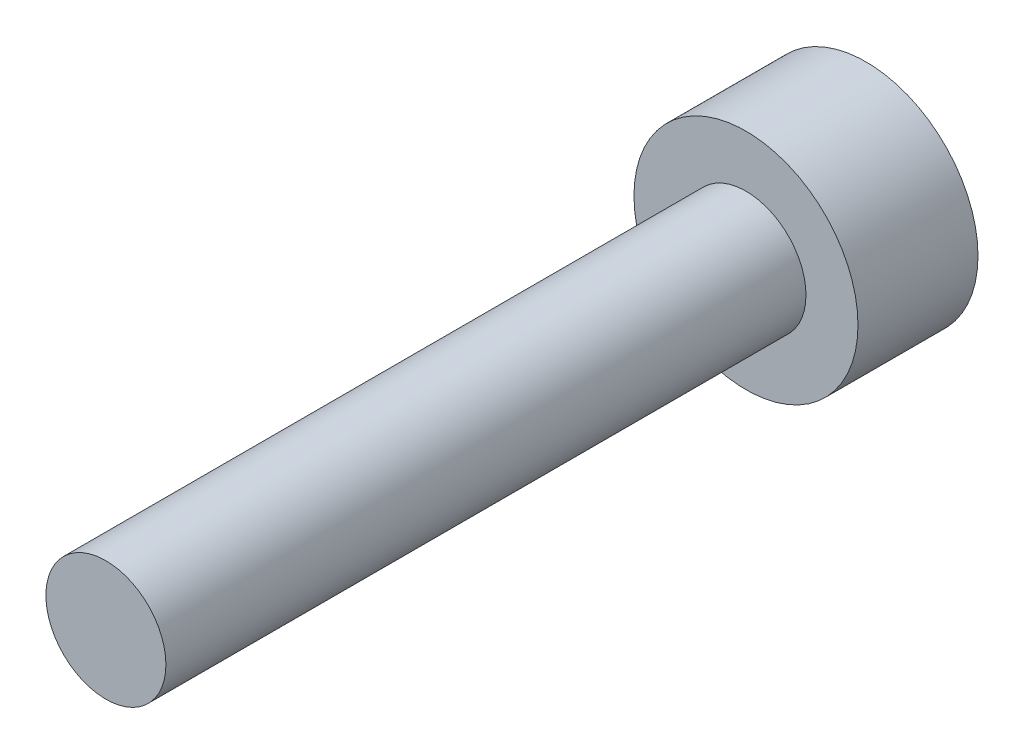
ISO-10303-21;
HEADER;
FILE_DESCRIPTION(('STEP AP214'),'2;1');
FILE_NAME('part.step','',(''),(''),'','','');
FILE_SCHEMA(('AUTOMOTIVE_DESIGN { 1 0 10303 214 1 1 1 1 }'));
ENDSEC;
DATA;
#1=APPLICATION_CONTEXT('core data for automotive mechanical design processes');
#2=APPLICATION_PROTOCOL_DEFINITION('international standard','automotive_design',2000,#1);
#3=PRODUCT_CONTEXT('',#1,'mechanical');
#4=PRODUCT('Part','Part','',(#3));
#5=PRODUCT_RELATED_PRODUCT_CATEGORY('part','',(#4));
#6=PRODUCT_DEFINITION_FORMATION('','',#4);
#7=PRODUCT_DEFINITION_CONTEXT('part definition',#1,'design');
#8=PRODUCT_DEFINITION('design','',#6,#7);
#9=PRODUCT_DEFINITION_SHAPE('','',#8);
#10=(LENGTH_UNIT() NAMED_UNIT(*) SI_UNIT(.MILLI.,.METRE.));
#11=(NAMED_UNIT(*) PLANE_ANGLE_UNIT() SI_UNIT($,.RADIAN.));
#12=(NAMED_UNIT(*) SI_UNIT($,.STERADIAN.) SOLID_ANGLE_UNIT());
#13=UNCERTAINTY_MEASURE_WITH_UNIT(LENGTH_MEASURE(1.E-05),#10,'distance_accuracy_value','');
#14=(GEOMETRIC_REPRESENTATION_CONTEXT(3) GLOBAL_UNCERTAINTY_ASSIGNED_CONTEXT((#13)) GLOBAL_UNIT_ASSIGNED_CONTEXT((#10,
#11,#12)) REPRESENTATION_CONTEXT('',''));
#15=CARTESIAN_POINT('',(0.,0.,0.));
#16=DIRECTION('',(0.,0.,1.));
#17=DIRECTION('',(1.,0.,0.));
#18=AXIS2_PLACEMENT_3D('',#15,#16,#17);
#19=CARTESIAN_POINT('',(0.,0.,-3.));
#20=DIRECTION('',(0.,0.,1.));
#21=DIRECTION('',(1.,0.,0.));
#22=AXIS2_PLACEMENT_3D('',#19,#20,#21);
#23=PLANE('',#22);
#24=CARTESIAN_POINT('',(0.,0.,-3.));
#25=DIRECTION('',(0.,0.,1.));
#26=DIRECTION('',(1.,0.,0.));
#27=AXIS2_PLACEMENT_3D('',#24,#25,#26);
#28=CIRCLE('',#27,2.8);
#29=CARTESIAN_POINT('',(2.8,0.,-3.));
#30=VERTEX_POINT('',#29);
#31=EDGE_CURVE('E112',#30,#30,#28,.T.);
#32=ORIENTED_EDGE('',*,*,#31,.F.);
#33=EDGE_LOOP('',(#32));
#34=FACE_BOUND('',#33,.T.);
#35=DIRECTION('',(0.,-1.,0.));
#36=VECTOR('',#35,1.);
#37=CARTESIAN_POINT('',(1.25,0.,-3.));
#38=LINE('',#37,#36);
#39=CARTESIAN_POINT('',(1.25,0.721687836487032,-3.));
#40=VERTEX_POINT('',#39);
#41=CARTESIAN_POINT('',(1.25,-0.721687836487033,-3.));
#42=VERTEX_POINT('',#41);
#43=EDGE_CURVE('E11',#40,#42,#38,.T.);
#44=ORIENTED_EDGE('',*,*,#43,.F.);
#45=DIRECTION('',(0.866025403784439,-0.5,0.));
#46=VECTOR('',#45,1.);
#47=CARTESIAN_POINT('',(0.625,1.08253175473055,-3.));
#48=LINE('',#47,#46);
#49=CARTESIAN_POINT('',(0.,1.44337567297406,-3.));
#50=VERTEX_POINT('',#49);
#51=EDGE_CURVE('E50',#50,#40,#48,.T.);
#52=ORIENTED_EDGE('',*,*,#51,.F.);
#53=DIRECTION('',(0.866025403784439,0.5,0.));
#54=VECTOR('',#53,1.);
#55=CARTESIAN_POINT('',(-0.625,1.08253175473055,-3.));
#56=LINE('',#55,#54);
#57=CARTESIAN_POINT('',(-1.25,0.721687836487032,-3.));
#58=VERTEX_POINT('',#57);
#59=EDGE_CURVE('E132',#58,#50,#56,.T.);
#60=ORIENTED_EDGE('',*,*,#59,.F.);
#61=DIRECTION('',(0.,1.,0.));
#62=VECTOR('',#61,1.);
#63=CARTESIAN_POINT('',(-1.25,0.,-3.));
#64=LINE('',#63,#62);
#65=CARTESIAN_POINT('',(-1.25,-0.721687836487032,-3.));
#66=VERTEX_POINT('',#65);
#67=EDGE_CURVE('E129',#66,#58,#64,.T.);
#68=ORIENTED_EDGE('',*,*,#67,.F.);
#69=DIRECTION('',(-0.866025403784439,0.5,0.));
#70=VECTOR('',#69,1.);
#71=CARTESIAN_POINT('',(-0.625,-1.08253175473055,-3.));
#72=LINE('',#71,#70);
#73=CARTESIAN_POINT('',(0.,-1.44337567297406,-3.));
#74=VERTEX_POINT('',#73);
#75=EDGE_CURVE('E130',#74,#66,#72,.T.);
#76=ORIENTED_EDGE('',*,*,#75,.F.);
#77=DIRECTION('',(-0.866025403784439,-0.5,0.));
#78=VECTOR('',#77,1.);
#79=CARTESIAN_POINT('',(0.624999999999999,-1.08253175473055,-3.));
#80=LINE('',#79,#78);
#81=EDGE_CURVE('E118',#42,#74,#80,.T.);
#82=ORIENTED_EDGE('',*,*,#81,.F.);
#83=EDGE_LOOP('',(#44,#52,#60,#68,#76,#82));
#84=FACE_BOUND('',#83,.T.);
#85=ADVANCED_FACE('F39',(#34,#84),#23,.F.);
#86=CARTESIAN_POINT('',(0.,0.,0.));
#87=DIRECTION('',(0.,0.,-1.));
#88=DIRECTION('',(-1.,0.,0.));
#89=AXIS2_PLACEMENT_3D('',#86,#87,#88);
#90=CYLINDRICAL_SURFACE('',#89,2.8);
#91=CARTESIAN_POINT('',(0.,0.,0.));
#92=DIRECTION('',(0.,0.,1.));
#93=DIRECTION('',(1.,0.,0.));
#94=AXIS2_PLACEMENT_3D('',#91,#92,#93);
#95=CIRCLE('',#94,2.8);
#96=CARTESIAN_POINT('',(2.8,0.,0.));
#97=VERTEX_POINT('',#96);
#98=EDGE_CURVE('E122',#97,#97,#95,.T.);
#99=ORIENTED_EDGE('',*,*,#98,.F.);
#100=EDGE_LOOP('',(#99));
#101=FACE_BOUND('',#100,.T.);
#102=ORIENTED_EDGE('',*,*,#31,.T.);
#103=EDGE_LOOP('',(#102));
#104=FACE_BOUND('',#103,.T.);
#105=ADVANCED_FACE('F41',(#101,#104),#90,.T.);
#106=CARTESIAN_POINT('',(0.,0.,0.));
#107=DIRECTION('',(0.,0.,1.));
#108=DIRECTION('',(1.,0.,0.));
#109=AXIS2_PLACEMENT_3D('',#106,#107,#108);
#110=PLANE('',#109);
#111=CARTESIAN_POINT('',(0.,0.,0.));
#112=DIRECTION('',(0.,0.,1.));
#113=DIRECTION('',(1.,0.,0.));
#114=AXIS2_PLACEMENT_3D('',#111,#112,#113);
#115=CIRCLE('',#114,1.5);
#116=CARTESIAN_POINT('',(1.5,0.,0.));
#117=VERTEX_POINT('',#116);
#118=EDGE_CURVE('E120',#117,#117,#115,.T.);
#119=ORIENTED_EDGE('',*,*,#118,.F.);
#120=EDGE_LOOP('',(#119));
#121=FACE_BOUND('',#120,.T.);
#122=ORIENTED_EDGE('',*,*,#98,.T.);
#123=EDGE_LOOP('',(#122));
#124=FACE_BOUND('',#123,.T.);
#125=ADVANCED_FACE('F179',(#121,#124),#110,.T.);
#126=CARTESIAN_POINT('',(0.,0.,16.));
#127=DIRECTION('',(0.,0.,-1.));
#128=DIRECTION('',(-1.,0.,0.));
#129=AXIS2_PLACEMENT_3D('',#126,#127,#128);
#130=CYLINDRICAL_SURFACE('',#129,1.5);
#131=CARTESIAN_POINT('',(0.,0.,16.));
#132=DIRECTION('',(0.,0.,1.));
#133=DIRECTION('',(1.,0.,0.));
#134=AXIS2_PLACEMENT_3D('',#131,#132,#133);
#135=CIRCLE('',#134,1.5);
#136=CARTESIAN_POINT('',(1.5,0.,16.));
#137=VERTEX_POINT('',#136);
#138=EDGE_CURVE('E110',#137,#137,#135,.T.);
#139=ORIENTED_EDGE('',*,*,#138,.F.);
#140=EDGE_LOOP('',(#139));
#141=FACE_BOUND('',#140,.T.);
#142=ORIENTED_EDGE('',*,*,#118,.T.);
#143=EDGE_LOOP('',(#142));
#144=FACE_BOUND('',#143,.T.);
#145=ADVANCED_FACE('F184',(#141,#144),#130,.T.);
#146=CARTESIAN_POINT('',(0.,0.,16.));
#147=DIRECTION('',(0.,0.,1.));
#148=DIRECTION('',(1.,0.,0.));
#149=AXIS2_PLACEMENT_3D('',#146,#147,#148);
#150=PLANE('',#149);
#151=ORIENTED_EDGE('',*,*,#138,.T.);
#152=EDGE_LOOP('',(#151));
#153=FACE_BOUND('',#152,.T.);
#154=ADVANCED_FACE('F189',(#153),#150,.T.);
#155=CARTESIAN_POINT('',(1.25,-0.721687836487033,-1.4));
#156=DIRECTION('',(-1.,0.,0.));
#157=DIRECTION('',(0.,-1.,0.));
#158=AXIS2_PLACEMENT_3D('',#155,#156,#157);
#159=PLANE('',#158);
#160=ORIENTED_EDGE('',*,*,#43,.T.);
#161=DIRECTION('',(0.,0.,-1.));
#162=VECTOR('',#161,1.);
#163=CARTESIAN_POINT('',(1.25,-0.721687836487033,-1.4));
#164=LINE('',#163,#162);
#165=CARTESIAN_POINT('',(1.25,-0.721687836487033,-1.4));
#166=VERTEX_POINT('',#165);
#167=EDGE_CURVE('E53',#166,#42,#164,.T.);
#168=ORIENTED_EDGE('',*,*,#167,.F.);
#169=DIRECTION('',(0.,1.,0.));
#170=VECTOR('',#169,1.);
#171=CARTESIAN_POINT('',(1.25,-0.721687836487033,-1.4));
#172=LINE('',#171,#170);
#173=CARTESIAN_POINT('',(1.25,0.721687836487032,-1.4));
#174=VERTEX_POINT('',#173);
#175=EDGE_CURVE('E96',#166,#174,#172,.T.);
#176=ORIENTED_EDGE('',*,*,#175,.T.);
#177=DIRECTION('',(0.,0.,-1.));
#178=VECTOR('',#177,1.);
#179=CARTESIAN_POINT('',(1.25,0.721687836487032,-1.4));
#180=LINE('',#179,#178);
#181=EDGE_CURVE('E103',#174,#40,#180,.T.);
#182=ORIENTED_EDGE('',*,*,#181,.T.);
#183=EDGE_LOOP('',(#160,#168,#176,#182));
#184=FACE_BOUND('',#183,.T.);
#185=ADVANCED_FACE('F105',(#184),#159,.T.);
#186=CARTESIAN_POINT('',(1.25,0.721687836487032,-1.4));
#187=DIRECTION('',(-0.5,-0.866025403784439,0.));
#188=DIRECTION('',(0.866025403784439,-0.5,0.));
#189=AXIS2_PLACEMENT_3D('',#186,#187,#188);
#190=PLANE('',#189);
#191=ORIENTED_EDGE('',*,*,#51,.T.);
#192=ORIENTED_EDGE('',*,*,#181,.F.);
#193=DIRECTION('',(-0.866025403784439,0.5,0.));
#194=VECTOR('',#193,1.);
#195=CARTESIAN_POINT('',(1.25,0.721687836487032,-1.4));
#196=LINE('',#195,#194);
#197=CARTESIAN_POINT('',(0.,1.44337567297406,-1.4));
#198=VERTEX_POINT('',#197);
#199=EDGE_CURVE('E95',#174,#198,#196,.T.);
#200=ORIENTED_EDGE('',*,*,#199,.T.);
#201=DIRECTION('',(0.,0.,-1.));
#202=VECTOR('',#201,1.);
#203=CARTESIAN_POINT('',(0.,1.44337567297406,-1.4));
#204=LINE('',#203,#202);
#205=EDGE_CURVE('E107',#198,#50,#204,.T.);
#206=ORIENTED_EDGE('',*,*,#205,.T.);
#207=EDGE_LOOP('',(#191,#192,#200,#206));
#208=FACE_BOUND('',#207,.T.);
#209=ADVANCED_FACE('F106',(#208),#190,.T.);
#210=CARTESIAN_POINT('',(0.,1.44337567297406,-1.4));
#211=DIRECTION('',(0.5,-0.866025403784439,0.));
#212=DIRECTION('',(0.866025403784439,0.5,0.));
#213=AXIS2_PLACEMENT_3D('',#210,#211,#212);
#214=PLANE('',#213);
#215=ORIENTED_EDGE('',*,*,#59,.T.);
#216=ORIENTED_EDGE('',*,*,#205,.F.);
#217=DIRECTION('',(-0.866025403784439,-0.5,0.));
#218=VECTOR('',#217,1.);
#219=CARTESIAN_POINT('',(0.,1.44337567297406,-1.4));
#220=LINE('',#219,#218);
#221=CARTESIAN_POINT('',(-1.25,0.721687836487032,-1.4));
#222=VERTEX_POINT('',#221);
#223=EDGE_CURVE('E98',#198,#222,#220,.T.);
#224=ORIENTED_EDGE('',*,*,#223,.T.);
#225=DIRECTION('',(0.,0.,-1.));
#226=VECTOR('',#225,1.);
#227=CARTESIAN_POINT('',(-1.25,0.721687836487032,-1.4));
#228=LINE('',#227,#226);
#229=EDGE_CURVE('E114',#222,#58,#228,.T.);
#230=ORIENTED_EDGE('',*,*,#229,.T.);
#231=EDGE_LOOP('',(#215,#216,#224,#230));
#232=FACE_BOUND('',#231,.T.);
#233=ADVANCED_FACE('F133',(#232),#214,.T.);
#234=CARTESIAN_POINT('',(-1.25,0.721687836487032,-1.4));
#235=DIRECTION('',(1.,0.,0.));
#236=DIRECTION('',(0.,1.,0.));
#237=AXIS2_PLACEMENT_3D('',#234,#235,#236);
#238=PLANE('',#237);
#239=ORIENTED_EDGE('',*,*,#67,.T.);
#240=ORIENTED_EDGE('',*,*,#229,.F.);
#241=DIRECTION('',(0.,-1.,0.));
#242=VECTOR('',#241,1.);
#243=CARTESIAN_POINT('',(-1.25,0.721687836487032,-1.4));
#244=LINE('',#243,#242);
#245=CARTESIAN_POINT('',(-1.25,-0.721687836487032,-1.4));
#246=VERTEX_POINT('',#245);
#247=EDGE_CURVE('E157',#222,#246,#244,.T.);
#248=ORIENTED_EDGE('',*,*,#247,.T.);
#249=DIRECTION('',(0.,0.,-1.));
#250=VECTOR('',#249,1.);
#251=CARTESIAN_POINT('',(-1.25,-0.721687836487032,-1.4));
#252=LINE('',#251,#250);
#253=EDGE_CURVE('E151',#246,#66,#252,.T.);
#254=ORIENTED_EDGE('',*,*,#253,.T.);
#255=EDGE_LOOP('',(#239,#240,#248,#254));
#256=FACE_BOUND('',#255,.T.);
#257=ADVANCED_FACE('F165',(#256),#238,.T.);
#258=CARTESIAN_POINT('',(-1.25,-0.721687836487032,-1.4));
#259=DIRECTION('',(0.5,0.866025403784439,0.));
#260=DIRECTION('',(-0.866025403784439,0.5,0.));
#261=AXIS2_PLACEMENT_3D('',#258,#259,#260);
#262=PLANE('',#261);
#263=ORIENTED_EDGE('',*,*,#75,.T.);
#264=ORIENTED_EDGE('',*,*,#253,.F.);
#265=DIRECTION('',(0.866025403784439,-0.5,0.));
#266=VECTOR('',#265,1.);
#267=CARTESIAN_POINT('',(-1.25,-0.721687836487032,-1.4));
#268=LINE('',#267,#266);
#269=CARTESIAN_POINT('',(0.,-1.44337567297406,-1.4));
#270=VERTEX_POINT('',#269);
#271=EDGE_CURVE('E147',#246,#270,#268,.T.);
#272=ORIENTED_EDGE('',*,*,#271,.T.);
#273=DIRECTION('',(0.,0.,-1.));
#274=VECTOR('',#273,1.);
#275=CARTESIAN_POINT('',(0.,-1.44337567297406,-1.4));
#276=LINE('',#275,#274);
#277=EDGE_CURVE('E145',#270,#74,#276,.T.);
#278=ORIENTED_EDGE('',*,*,#277,.T.);
#279=EDGE_LOOP('',(#263,#264,#272,#278));
#280=FACE_BOUND('',#279,.T.);
#281=ADVANCED_FACE('F148',(#280),#262,.T.);
#282=CARTESIAN_POINT('',(0.,-1.44337567297406,-1.4));
#283=DIRECTION('',(-0.5,0.866025403784439,0.));
#284=DIRECTION('',(-0.866025403784439,-0.5,0.));
#285=AXIS2_PLACEMENT_3D('',#282,#283,#284);
#286=PLANE('',#285);
#287=ORIENTED_EDGE('',*,*,#81,.T.);
#288=ORIENTED_EDGE('',*,*,#277,.F.);
#289=DIRECTION('',(0.866025403784439,0.5,0.));
#290=VECTOR('',#289,1.);
#291=CARTESIAN_POINT('',(0.,-1.44337567297406,-1.4));
#292=LINE('',#291,#290);
#293=EDGE_CURVE('E152',#270,#166,#292,.T.);
#294=ORIENTED_EDGE('',*,*,#293,.T.);
#295=ORIENTED_EDGE('',*,*,#167,.T.);
#296=EDGE_LOOP('',(#287,#288,#294,#295));
#297=FACE_BOUND('',#296,.T.);
#298=ADVANCED_FACE('F141',(#297),#286,.T.);
#299=CARTESIAN_POINT('',(0.,0.,-1.4));
#300=DIRECTION('',(0.,0.,1.));
#301=DIRECTION('',(1.,0.,0.));
#302=AXIS2_PLACEMENT_3D('',#299,#300,#301);
#303=PLANE('',#302);
#304=ORIENTED_EDGE('',*,*,#175,.F.);
#305=ORIENTED_EDGE('',*,*,#293,.F.);
#306=ORIENTED_EDGE('',*,*,#271,.F.);
#307=ORIENTED_EDGE('',*,*,#247,.F.);
#308=ORIENTED_EDGE('',*,*,#223,.F.);
#309=ORIENTED_EDGE('',*,*,#199,.F.);
#310=EDGE_LOOP('',(#304,#305,#306,#307,#308,#309));
#311=FACE_BOUND('',#310,.T.);
#312=ADVANCED_FACE('F94',(#311),#303,.F.);
#313=CLOSED_SHELL('',(#85,#105,#125,#145,#154,#185,#209,#233,#257,#281,#298,#312));
#314=MANIFOLD_SOLID_BREP('B2',#313);
#315=ADVANCED_BREP_SHAPE_REPRESENTATION('',(#18,#314),#14);
#316=SHAPE_DEFINITION_REPRESENTATION(#9,#315);
ENDSEC;
END-ISO-10303-21;
